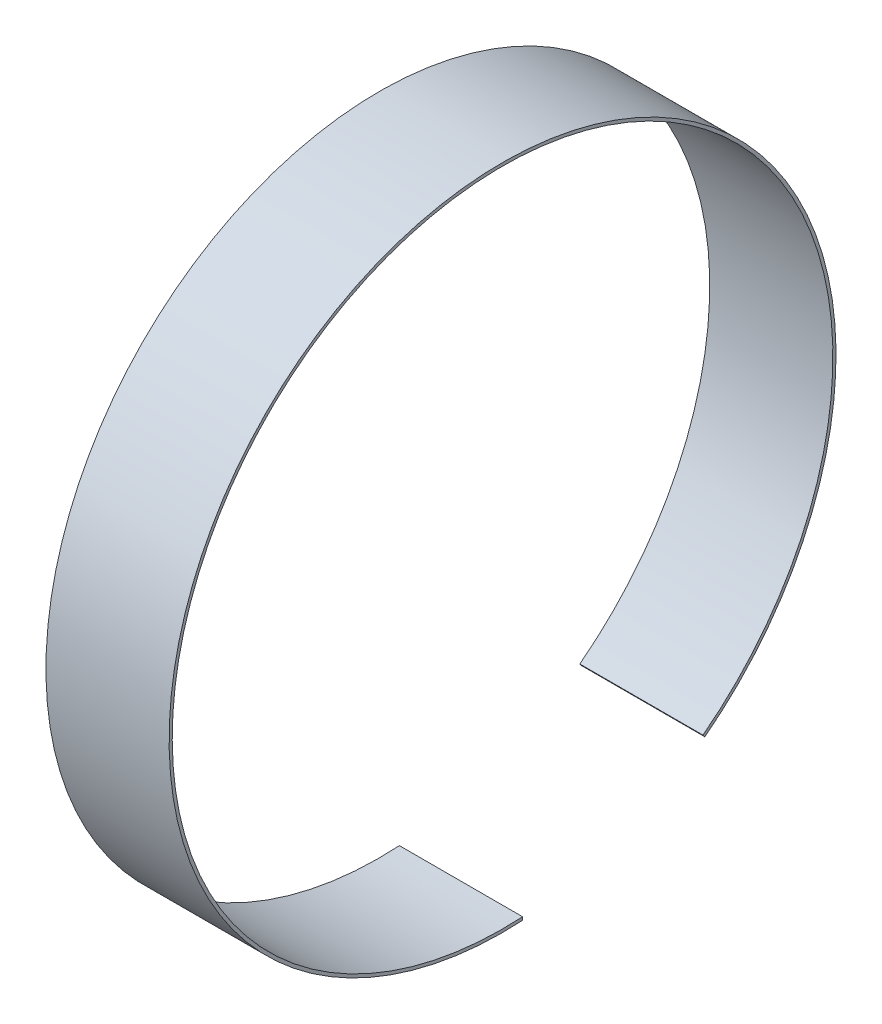
ISO-10303-21;
HEADER;
FILE_DESCRIPTION(('STEP AP214'),'2;1');
FILE_NAME('part.step','',(''),(''),'','','');
FILE_SCHEMA(('AUTOMOTIVE_DESIGN { 1 0 10303 214 1 1 1 1 }'));
ENDSEC;
DATA;
#1=APPLICATION_CONTEXT('core data for automotive mechanical design processes');
#2=APPLICATION_PROTOCOL_DEFINITION('international standard','automotive_design',2000,#1);
#3=PRODUCT_CONTEXT('',#1,'mechanical');
#4=PRODUCT('Part','Part','',(#3));
#5=PRODUCT_RELATED_PRODUCT_CATEGORY('part','',(#4));
#6=PRODUCT_DEFINITION_FORMATION('','',#4);
#7=PRODUCT_DEFINITION_CONTEXT('part definition',#1,'design');
#8=PRODUCT_DEFINITION('design','',#6,#7);
#9=PRODUCT_DEFINITION_SHAPE('','',#8);
#10=(LENGTH_UNIT() NAMED_UNIT(*) SI_UNIT(.MILLI.,.METRE.));
#11=(NAMED_UNIT(*) PLANE_ANGLE_UNIT() SI_UNIT($,.RADIAN.));
#12=(NAMED_UNIT(*) SI_UNIT($,.STERADIAN.) SOLID_ANGLE_UNIT());
#13=UNCERTAINTY_MEASURE_WITH_UNIT(LENGTH_MEASURE(1.E-05),#10,'distance_accuracy_value','');
#14=(GEOMETRIC_REPRESENTATION_CONTEXT(3) GLOBAL_UNCERTAINTY_ASSIGNED_CONTEXT((#13)) GLOBAL_UNIT_ASSIGNED_CONTEXT((#10,
#11,#12)) REPRESENTATION_CONTEXT('',''));
#15=CARTESIAN_POINT('',(0.,0.,0.));
#16=DIRECTION('',(0.,0.,1.));
#17=DIRECTION('',(1.,0.,0.));
#18=AXIS2_PLACEMENT_3D('',#15,#16,#17);
#19=CARTESIAN_POINT('',(13.85,0.,0.));
#20=DIRECTION('',(-1.,0.,0.));
#21=DIRECTION('',(0.,0.,1.));
#22=AXIS2_PLACEMENT_3D('',#19,#20,#21);
#23=CYLINDRICAL_SURFACE('',#22,74.3);
#24=CARTESIAN_POINT('',(-13.85,0.,0.));
#25=DIRECTION('',(1.,0.,0.));
#26=DIRECTION('',(0.,0.,-1.));
#27=AXIS2_PLACEMENT_3D('',#24,#25,#26);
#28=CIRCLE('',#27,74.3);
#29=CARTESIAN_POINT('',(-13.85,-59.0652548025393,-45.0753333333332));
#30=VERTEX_POINT('',#29);
#31=CARTESIAN_POINT('',(-13.85,-74.1636029329751,-4.50000000000001));
#32=VERTEX_POINT('',#31);
#33=EDGE_CURVE('E119',#30,#32,#28,.T.);
#34=ORIENTED_EDGE('',*,*,#33,.F.);
#35=DIRECTION('',(-1.,0.,0.));
#36=VECTOR('',#35,1.);
#37=CARTESIAN_POINT('',(13.85,-59.0652548025393,-45.0753333333332));
#38=LINE('',#37,#36);
#39=CARTESIAN_POINT('',(13.85,-59.0652548025393,-45.0753333333332));
#40=VERTEX_POINT('',#39);
#41=EDGE_CURVE('E11',#40,#30,#38,.T.);
#42=ORIENTED_EDGE('',*,*,#41,.F.);
#43=CARTESIAN_POINT('',(13.85,0.,0.));
#44=DIRECTION('',(1.,0.,0.));
#45=DIRECTION('',(0.,0.,-1.));
#46=AXIS2_PLACEMENT_3D('',#43,#44,#45);
#47=CIRCLE('',#46,74.3);
#48=CARTESIAN_POINT('',(13.85,-74.1636029329751,-4.50000000000001));
#49=VERTEX_POINT('',#48);
#50=EDGE_CURVE('E109',#40,#49,#47,.T.);
#51=ORIENTED_EDGE('',*,*,#50,.T.);
#52=DIRECTION('',(-1.,0.,0.));
#53=VECTOR('',#52,1.);
#54=CARTESIAN_POINT('',(13.85,-74.1636029329751,-4.50000000000001));
#55=LINE('',#54,#53);
#56=EDGE_CURVE('E60',#49,#32,#55,.T.);
#57=ORIENTED_EDGE('',*,*,#56,.T.);
#58=EDGE_LOOP('',(#34,#42,#51,#57));
#59=FACE_BOUND('',#58,.T.);
#60=ADVANCED_FACE('F40',(#59),#23,.F.);
#61=CARTESIAN_POINT('',(13.85,0.,0.));
#62=DIRECTION('',(0.,-0.606666666666665,0.794956323048982));
#63=DIRECTION('',(0.,-0.794956323048982,-0.606666666666665));
#64=AXIS2_PLACEMENT_3D('',#61,#62,#63);
#65=PLANE('',#64);
#66=DIRECTION('',(0.,0.794956323048982,0.606666666666665));
#67=VECTOR('',#66,1.);
#68=CARTESIAN_POINT('',(-13.85,0.,0.));
#69=LINE('',#68,#67);
#70=CARTESIAN_POINT('',(-13.85,-59.6217242286738,-45.5));
#71=VERTEX_POINT('',#70);
#72=EDGE_CURVE('E97',#71,#30,#69,.T.);
#73=ORIENTED_EDGE('',*,*,#72,.F.);
#74=DIRECTION('',(-1.,0.,0.));
#75=VECTOR('',#74,1.);
#76=CARTESIAN_POINT('',(13.85,-59.6217242286738,-45.5));
#77=LINE('',#76,#75);
#78=CARTESIAN_POINT('',(13.85,-59.6217242286738,-45.5));
#79=VERTEX_POINT('',#78);
#80=EDGE_CURVE('E49',#79,#71,#77,.T.);
#81=ORIENTED_EDGE('',*,*,#80,.F.);
#82=DIRECTION('',(0.,0.794956323048982,0.606666666666665));
#83=VECTOR('',#82,1.);
#84=CARTESIAN_POINT('',(13.85,0.,0.));
#85=LINE('',#84,#83);
#86=EDGE_CURVE('E95',#79,#40,#85,.T.);
#87=ORIENTED_EDGE('',*,*,#86,.T.);
#88=ORIENTED_EDGE('',*,*,#41,.T.);
#89=EDGE_LOOP('',(#73,#81,#87,#88));
#90=FACE_BOUND('',#89,.T.);
#91=ADVANCED_FACE('F93',(#90),#65,.T.);
#92=CARTESIAN_POINT('',(13.85,0.,0.));
#93=DIRECTION('',(-1.,0.,0.));
#94=DIRECTION('',(0.,0.,1.));
#95=AXIS2_PLACEMENT_3D('',#92,#93,#94);
#96=CYLINDRICAL_SURFACE('',#95,75.);
#97=CARTESIAN_POINT('',(-13.85,0.,0.));
#98=DIRECTION('',(1.,0.,0.));
#99=DIRECTION('',(0.,0.,-1.));
#100=AXIS2_PLACEMENT_3D('',#97,#98,#99);
#101=CIRCLE('',#100,75.);
#102=CARTESIAN_POINT('',(-13.85,-74.8648782808086,-4.50000000000001));
#103=VERTEX_POINT('',#102);
#104=EDGE_CURVE('E123',#71,#103,#101,.T.);
#105=ORIENTED_EDGE('',*,*,#104,.T.);
#106=DIRECTION('',(-1.,0.,0.));
#107=VECTOR('',#106,1.);
#108=CARTESIAN_POINT('',(13.85,-74.8648782808086,-4.50000000000001));
#109=LINE('',#108,#107);
#110=CARTESIAN_POINT('',(13.85,-74.8648782808086,-4.50000000000001));
#111=VERTEX_POINT('',#110);
#112=EDGE_CURVE('E78',#111,#103,#109,.T.);
#113=ORIENTED_EDGE('',*,*,#112,.F.);
#114=CARTESIAN_POINT('',(13.85,0.,0.));
#115=DIRECTION('',(1.,0.,0.));
#116=DIRECTION('',(0.,0.,-1.));
#117=AXIS2_PLACEMENT_3D('',#114,#115,#116);
#118=CIRCLE('',#117,75.);
#119=EDGE_CURVE('E101',#79,#111,#118,.T.);
#120=ORIENTED_EDGE('',*,*,#119,.F.);
#121=ORIENTED_EDGE('',*,*,#80,.T.);
#122=EDGE_LOOP('',(#105,#113,#120,#121));
#123=FACE_BOUND('',#122,.T.);
#124=ADVANCED_FACE('F102',(#123),#96,.T.);
#125=CARTESIAN_POINT('',(13.85,0.,-4.5));
#126=DIRECTION('',(0.,0.,-1.));
#127=DIRECTION('',(0.,1.,0.));
#128=AXIS2_PLACEMENT_3D('',#125,#126,#127);
#129=PLANE('',#128);
#130=DIRECTION('',(0.,-1.,0.));
#131=VECTOR('',#130,1.);
#132=CARTESIAN_POINT('',(-13.85,0.,-4.5));
#133=LINE('',#132,#131);
#134=EDGE_CURVE('E114',#32,#103,#133,.T.);
#135=ORIENTED_EDGE('',*,*,#134,.F.);
#136=ORIENTED_EDGE('',*,*,#56,.F.);
#137=DIRECTION('',(0.,-1.,0.));
#138=VECTOR('',#137,1.);
#139=CARTESIAN_POINT('',(13.85,0.,-4.5));
#140=LINE('',#139,#138);
#141=EDGE_CURVE('E106',#49,#111,#140,.T.);
#142=ORIENTED_EDGE('',*,*,#141,.T.);
#143=ORIENTED_EDGE('',*,*,#112,.T.);
#144=EDGE_LOOP('',(#135,#136,#142,#143));
#145=FACE_BOUND('',#144,.T.);
#146=ADVANCED_FACE('F134',(#145),#129,.T.);
#147=CARTESIAN_POINT('',(13.85,0.,0.));
#148=DIRECTION('',(1.,0.,0.));
#149=DIRECTION('',(0.,0.,-1.));
#150=AXIS2_PLACEMENT_3D('',#147,#148,#149);
#151=PLANE('',#150);
#152=ORIENTED_EDGE('',*,*,#50,.F.);
#153=ORIENTED_EDGE('',*,*,#86,.F.);
#154=ORIENTED_EDGE('',*,*,#119,.T.);
#155=ORIENTED_EDGE('',*,*,#141,.F.);
#156=EDGE_LOOP('',(#152,#153,#154,#155));
#157=FACE_BOUND('',#156,.T.);
#158=ADVANCED_FACE('F108',(#157),#151,.T.);
#159=CARTESIAN_POINT('',(-13.85,0.,0.));
#160=DIRECTION('',(1.,0.,0.));
#161=DIRECTION('',(0.,0.,-1.));
#162=AXIS2_PLACEMENT_3D('',#159,#160,#161);
#163=PLANE('',#162);
#164=ORIENTED_EDGE('',*,*,#33,.T.);
#165=ORIENTED_EDGE('',*,*,#134,.T.);
#166=ORIENTED_EDGE('',*,*,#104,.F.);
#167=ORIENTED_EDGE('',*,*,#72,.T.);
#168=EDGE_LOOP('',(#164,#165,#166,#167));
#169=FACE_BOUND('',#168,.T.);
#170=ADVANCED_FACE('F133',(#169),#163,.F.);
#171=CLOSED_SHELL('',(#60,#91,#124,#146,#158,#170));
#172=MANIFOLD_SOLID_BREP('B2',#171);
#173=ADVANCED_BREP_SHAPE_REPRESENTATION('',(#18,#172),#14);
#174=SHAPE_DEFINITION_REPRESENTATION(#9,#173);
ENDSEC;
END-ISO-10303-21;
